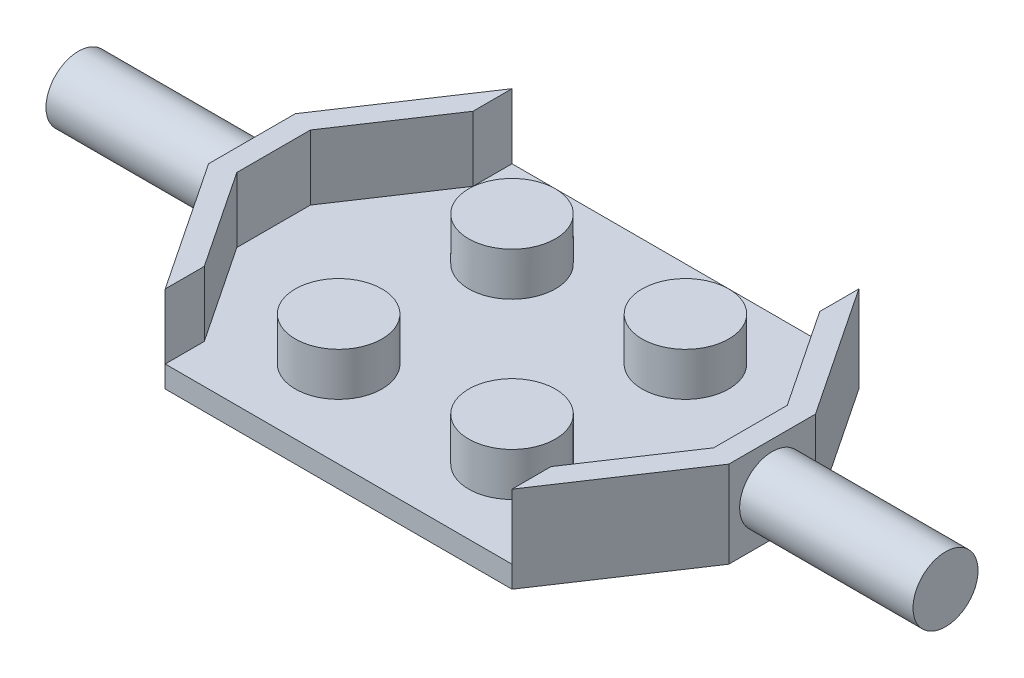
ISO-10303-21;
HEADER;
FILE_DESCRIPTION(('STEP AP214'),'2;1');
FILE_NAME('part.step','',(''),(''),'','','');
FILE_SCHEMA(('AUTOMOTIVE_DESIGN { 1 0 10303 214 1 1 1 1 }'));
ENDSEC;
DATA;
#1=APPLICATION_CONTEXT('core data for automotive mechanical design processes');
#2=APPLICATION_PROTOCOL_DEFINITION('international standard','automotive_design',2000,#1);
#3=PRODUCT_CONTEXT('',#1,'mechanical');
#4=PRODUCT('Part','Part','',(#3));
#5=PRODUCT_RELATED_PRODUCT_CATEGORY('part','',(#4));
#6=PRODUCT_DEFINITION_FORMATION('','',#4);
#7=PRODUCT_DEFINITION_CONTEXT('part definition',#1,'design');
#8=PRODUCT_DEFINITION('design','',#6,#7);
#9=PRODUCT_DEFINITION_SHAPE('','',#8);
#10=(LENGTH_UNIT() NAMED_UNIT(*) SI_UNIT(.MILLI.,.METRE.));
#11=(NAMED_UNIT(*) PLANE_ANGLE_UNIT() SI_UNIT($,.RADIAN.));
#12=(NAMED_UNIT(*) SI_UNIT($,.STERADIAN.) SOLID_ANGLE_UNIT());
#13=UNCERTAINTY_MEASURE_WITH_UNIT(LENGTH_MEASURE(1.E-05),#10,'distance_accuracy_value','');
#14=(GEOMETRIC_REPRESENTATION_CONTEXT(3) GLOBAL_UNCERTAINTY_ASSIGNED_CONTEXT((#13)) GLOBAL_UNIT_ASSIGNED_CONTEXT((#10,
#11,#12)) REPRESENTATION_CONTEXT('',''));
#15=CARTESIAN_POINT('',(0.,0.,0.));
#16=DIRECTION('',(0.,0.,1.));
#17=DIRECTION('',(1.,0.,0.));
#18=AXIS2_PLACEMENT_3D('',#15,#16,#17);
#19=CARTESIAN_POINT('',(0.,1.,0.));
#20=DIRECTION('',(0.,-1.,0.));
#21=DIRECTION('',(0.,0.,-1.));
#22=AXIS2_PLACEMENT_3D('',#19,#20,#21);
#23=PLANE('',#22);
#24=CARTESIAN_POINT('',(4.,1.,-4.));
#25=DIRECTION('',(0.,-1.,0.));
#26=DIRECTION('',(0.,0.,1.));
#27=AXIS2_PLACEMENT_3D('',#24,#25,#26);
#28=CIRCLE('',#27,2.);
#29=CARTESIAN_POINT('',(4.,1.,-2.));
#30=VERTEX_POINT('',#29);
#31=EDGE_CURVE('E263',#30,#30,#28,.T.);
#32=ORIENTED_EDGE('',*,*,#31,.T.);
#33=EDGE_LOOP('',(#32));
#34=FACE_BOUND('',#33,.T.);
#35=CARTESIAN_POINT('',(4.,1.,4.));
#36=DIRECTION('',(0.,-1.,0.));
#37=DIRECTION('',(0.,0.,-1.));
#38=AXIS2_PLACEMENT_3D('',#35,#36,#37);
#39=CIRCLE('',#38,2.);
#40=CARTESIAN_POINT('',(4.,1.,2.));
#41=VERTEX_POINT('',#40);
#42=EDGE_CURVE('E11',#41,#41,#39,.F.);
#43=ORIENTED_EDGE('',*,*,#42,.F.);
#44=EDGE_LOOP('',(#43));
#45=FACE_BOUND('',#44,.T.);
#46=CARTESIAN_POINT('',(-4.,1.,4.));
#47=DIRECTION('',(0.,-1.,0.));
#48=DIRECTION('',(0.,0.,-1.));
#49=AXIS2_PLACEMENT_3D('',#46,#47,#48);
#50=CIRCLE('',#49,2.);
#51=CARTESIAN_POINT('',(-4.,1.,2.));
#52=VERTEX_POINT('',#51);
#53=EDGE_CURVE('E370',#52,#52,#50,.T.);
#54=ORIENTED_EDGE('',*,*,#53,.T.);
#55=EDGE_LOOP('',(#54));
#56=FACE_BOUND('',#55,.T.);
#57=CARTESIAN_POINT('',(-4.,1.,-4.));
#58=DIRECTION('',(0.,-1.,0.));
#59=DIRECTION('',(0.,0.,-1.));
#60=AXIS2_PLACEMENT_3D('',#57,#58,#59);
#61=CIRCLE('',#60,2.);
#62=CARTESIAN_POINT('',(-4.,1.,-6.));
#63=VERTEX_POINT('',#62);
#64=EDGE_CURVE('E301',#63,#63,#61,.F.);
#65=ORIENTED_EDGE('',*,*,#64,.F.);
#66=EDGE_LOOP('',(#65));
#67=FACE_BOUND('',#66,.T.);
#68=DIRECTION('',(-0.554700196225229,0.,-0.832050294337844));
#69=VECTOR('',#68,1.);
#70=CARTESIAN_POINT('',(8.,1.,-6.197224362268));
#71=LINE('',#70,#69);
#72=CARTESIAN_POINT('',(11.,1.,-1.697224362268));
#73=VERTEX_POINT('',#72);
#74=CARTESIAN_POINT('',(8.,1.,-6.197224362268));
#75=VERTEX_POINT('',#74);
#76=EDGE_CURVE('E231',#73,#75,#71,.T.);
#77=ORIENTED_EDGE('',*,*,#76,.T.);
#78=DIRECTION('',(0.,0.,-1.));
#79=VECTOR('',#78,1.);
#80=CARTESIAN_POINT('',(8.,1.,-8.));
#81=LINE('',#80,#79);
#82=CARTESIAN_POINT('',(8.,1.,-8.));
#83=VERTEX_POINT('',#82);
#84=EDGE_CURVE('E227',#75,#83,#81,.T.);
#85=ORIENTED_EDGE('',*,*,#84,.T.);
#86=DIRECTION('',(-1.,0.,0.));
#87=VECTOR('',#86,1.);
#88=CARTESIAN_POINT('',(0.,1.,-8.));
#89=LINE('',#88,#87);
#90=CARTESIAN_POINT('',(-8.,1.,-8.));
#91=VERTEX_POINT('',#90);
#92=EDGE_CURVE('E383',#83,#91,#89,.T.);
#93=ORIENTED_EDGE('',*,*,#92,.T.);
#94=DIRECTION('',(0.,0.,-1.));
#95=VECTOR('',#94,1.);
#96=CARTESIAN_POINT('',(-8.,1.,-8.));
#97=LINE('',#96,#95);
#98=CARTESIAN_POINT('',(-8.,1.,-6.197224362268));
#99=VERTEX_POINT('',#98);
#100=EDGE_CURVE('E307',#99,#91,#97,.T.);
#101=ORIENTED_EDGE('',*,*,#100,.F.);
#102=DIRECTION('',(0.554700196225229,0.,-0.832050294337844));
#103=VECTOR('',#102,1.);
#104=CARTESIAN_POINT('',(-8.,1.,-6.197224362268));
#105=LINE('',#104,#103);
#106=CARTESIAN_POINT('',(-11.,1.,-1.697224362268));
#107=VERTEX_POINT('',#106);
#108=EDGE_CURVE('E336',#107,#99,#105,.T.);
#109=ORIENTED_EDGE('',*,*,#108,.F.);
#110=DIRECTION('',(0.,0.,-1.));
#111=VECTOR('',#110,1.);
#112=CARTESIAN_POINT('',(-11.,1.,-1.697224362268));
#113=LINE('',#112,#111);
#114=CARTESIAN_POINT('',(-11.,1.,1.69722436226801));
#115=VERTEX_POINT('',#114);
#116=EDGE_CURVE('E68',#115,#107,#113,.T.);
#117=ORIENTED_EDGE('',*,*,#116,.F.);
#118=DIRECTION('',(-0.554700196225229,0.,-0.832050294337844));
#119=VECTOR('',#118,1.);
#120=CARTESIAN_POINT('',(-11.,1.,1.69722436226801));
#121=LINE('',#120,#119);
#122=CARTESIAN_POINT('',(-8.,1.,6.19722436226801));
#123=VERTEX_POINT('',#122);
#124=EDGE_CURVE('E63',#123,#115,#121,.T.);
#125=ORIENTED_EDGE('',*,*,#124,.F.);
#126=DIRECTION('',(0.,0.,-1.));
#127=VECTOR('',#126,1.);
#128=CARTESIAN_POINT('',(-8.,1.,6.19722436226801));
#129=LINE('',#128,#127);
#130=CARTESIAN_POINT('',(-8.,1.,8.));
#131=VERTEX_POINT('',#130);
#132=EDGE_CURVE('E297',#131,#123,#129,.T.);
#133=ORIENTED_EDGE('',*,*,#132,.F.);
#134=DIRECTION('',(1.,0.,0.));
#135=VECTOR('',#134,1.);
#136=CARTESIAN_POINT('',(0.,1.,8.));
#137=LINE('',#136,#135);
#138=CARTESIAN_POINT('',(8.,1.,8.));
#139=VERTEX_POINT('',#138);
#140=EDGE_CURVE('E379',#131,#139,#137,.T.);
#141=ORIENTED_EDGE('',*,*,#140,.T.);
#142=DIRECTION('',(0.,0.,-1.));
#143=VECTOR('',#142,1.);
#144=CARTESIAN_POINT('',(8.,1.,6.19722436226801));
#145=LINE('',#144,#143);
#146=CARTESIAN_POINT('',(8.,1.,6.19722436226801));
#147=VERTEX_POINT('',#146);
#148=EDGE_CURVE('E196',#139,#147,#145,.T.);
#149=ORIENTED_EDGE('',*,*,#148,.T.);
#150=DIRECTION('',(0.554700196225229,0.,-0.832050294337844));
#151=VECTOR('',#150,1.);
#152=CARTESIAN_POINT('',(11.,1.,1.69722436226801));
#153=LINE('',#152,#151);
#154=CARTESIAN_POINT('',(11.,1.,1.69722436226801));
#155=VERTEX_POINT('',#154);
#156=EDGE_CURVE('E240',#147,#155,#153,.T.);
#157=ORIENTED_EDGE('',*,*,#156,.T.);
#158=DIRECTION('',(0.,0.,-1.));
#159=VECTOR('',#158,1.);
#160=CARTESIAN_POINT('',(11.,1.,-1.697224362268));
#161=LINE('',#160,#159);
#162=EDGE_CURVE('E236',#155,#73,#161,.T.);
#163=ORIENTED_EDGE('',*,*,#162,.T.);
#164=EDGE_LOOP('',(#77,#85,#93,#101,#109,#117,#125,#133,#141,#149,#157,#163));
#165=FACE_BOUND('',#164,.T.);
#166=ADVANCED_FACE('F47',(#34,#45,#56,#67,#165),#23,.F.);
#167=CARTESIAN_POINT('',(0.,1.,8.));
#168=DIRECTION('',(0.,0.,-1.));
#169=DIRECTION('',(-1.,0.,0.));
#170=AXIS2_PLACEMENT_3D('',#167,#168,#169);
#171=PLANE('',#170);
#172=DIRECTION('',(1.,0.,0.));
#173=VECTOR('',#172,1.);
#174=CARTESIAN_POINT('',(0.,0.,8.));
#175=LINE('',#174,#173);
#176=CARTESIAN_POINT('',(-8.,0.,8.));
#177=VERTEX_POINT('',#176);
#178=CARTESIAN_POINT('',(8.,0.,8.));
#179=VERTEX_POINT('',#178);
#180=EDGE_CURVE('E375',#177,#179,#175,.T.);
#181=ORIENTED_EDGE('',*,*,#180,.T.);
#182=DIRECTION('',(0.,-1.,0.));
#183=VECTOR('',#182,1.);
#184=CARTESIAN_POINT('',(8.,1.,8.));
#185=LINE('',#184,#183);
#186=EDGE_CURVE('E289',#139,#179,#185,.T.);
#187=ORIENTED_EDGE('',*,*,#186,.F.);
#188=ORIENTED_EDGE('',*,*,#140,.F.);
#189=DIRECTION('',(0.,-1.,0.));
#190=VECTOR('',#189,1.);
#191=CARTESIAN_POINT('',(-8.,1.,8.));
#192=LINE('',#191,#190);
#193=EDGE_CURVE('E387',#131,#177,#192,.T.);
#194=ORIENTED_EDGE('',*,*,#193,.T.);
#195=EDGE_LOOP('',(#181,#187,#188,#194));
#196=FACE_BOUND('',#195,.T.);
#197=ADVANCED_FACE('F49',(#196),#171,.F.);
#198=CARTESIAN_POINT('',(0.,1.,-8.));
#199=DIRECTION('',(0.,0.,1.));
#200=DIRECTION('',(1.,0.,0.));
#201=AXIS2_PLACEMENT_3D('',#198,#199,#200);
#202=PLANE('',#201);
#203=DIRECTION('',(-1.,0.,0.));
#204=VECTOR('',#203,1.);
#205=CARTESIAN_POINT('',(0.,0.,-8.));
#206=LINE('',#205,#204);
#207=CARTESIAN_POINT('',(8.,0.,-8.));
#208=VERTEX_POINT('',#207);
#209=CARTESIAN_POINT('',(-8.,0.,-8.));
#210=VERTEX_POINT('',#209);
#211=EDGE_CURVE('E390',#208,#210,#206,.T.);
#212=ORIENTED_EDGE('',*,*,#211,.T.);
#213=DIRECTION('',(0.,-1.,0.));
#214=VECTOR('',#213,1.);
#215=CARTESIAN_POINT('',(-8.,1.,-8.));
#216=LINE('',#215,#214);
#217=EDGE_CURVE('E412',#91,#210,#216,.T.);
#218=ORIENTED_EDGE('',*,*,#217,.F.);
#219=ORIENTED_EDGE('',*,*,#92,.F.);
#220=DIRECTION('',(0.,-1.,0.));
#221=VECTOR('',#220,1.);
#222=CARTESIAN_POINT('',(8.,1.,-8.));
#223=LINE('',#222,#221);
#224=EDGE_CURVE('E184',#83,#208,#223,.T.);
#225=ORIENTED_EDGE('',*,*,#224,.T.);
#226=EDGE_LOOP('',(#212,#218,#219,#225));
#227=FACE_BOUND('',#226,.T.);
#228=ADVANCED_FACE('F452',(#227),#202,.F.);
#229=CARTESIAN_POINT('',(-8.,1.,-8.));
#230=DIRECTION('',(0.832050294337844,0.,0.554700196225229));
#231=DIRECTION('',(0.554700196225229,0.,-0.832050294337844));
#232=AXIS2_PLACEMENT_3D('',#229,#230,#231);
#233=PLANE('',#232);
#234=DIRECTION('',(-0.554700196225229,0.,0.832050294337844));
#235=VECTOR('',#234,1.);
#236=CARTESIAN_POINT('',(-8.,0.,-8.));
#237=LINE('',#236,#235);
#238=CARTESIAN_POINT('',(-12.,0.,-2.));
#239=VERTEX_POINT('',#238);
#240=EDGE_CURVE('E393',#210,#239,#237,.T.);
#241=ORIENTED_EDGE('',*,*,#240,.T.);
#242=DIRECTION('',(0.,-1.,0.));
#243=VECTOR('',#242,1.);
#244=CARTESIAN_POINT('',(-12.,1.,-2.));
#245=LINE('',#244,#243);
#246=CARTESIAN_POINT('',(-12.,4.,-2.));
#247=VERTEX_POINT('',#246);
#248=EDGE_CURVE('E408',#247,#239,#245,.T.);
#249=ORIENTED_EDGE('',*,*,#248,.F.);
#250=DIRECTION('',(-0.554700196225229,0.,0.832050294337844));
#251=VECTOR('',#250,1.);
#252=CARTESIAN_POINT('',(-8.,4.,-8.));
#253=LINE('',#252,#251);
#254=CARTESIAN_POINT('',(-8.,4.,-8.));
#255=VERTEX_POINT('',#254);
#256=EDGE_CURVE('E325',#255,#247,#253,.T.);
#257=ORIENTED_EDGE('',*,*,#256,.F.);
#258=DIRECTION('',(0.,-1.,0.));
#259=VECTOR('',#258,1.);
#260=CARTESIAN_POINT('',(-8.,4.,-8.));
#261=LINE('',#260,#259);
#262=EDGE_CURVE('E329',#255,#91,#261,.T.);
#263=ORIENTED_EDGE('',*,*,#262,.T.);
#264=ORIENTED_EDGE('',*,*,#217,.T.);
#265=EDGE_LOOP('',(#241,#249,#257,#263,#264));
#266=FACE_BOUND('',#265,.T.);
#267=ADVANCED_FACE('F490',(#266),#233,.F.);
#268=CARTESIAN_POINT('',(-12.,1.,2.));
#269=DIRECTION('',(1.,0.,0.));
#270=DIRECTION('',(0.,0.,-1.));
#271=AXIS2_PLACEMENT_3D('',#268,#269,#270);
#272=PLANE('',#271);
#273=CARTESIAN_POINT('',(-12.,2.,0.));
#274=DIRECTION('',(-1.,0.,0.));
#275=DIRECTION('',(0.,0.,1.));
#276=AXIS2_PLACEMENT_3D('',#273,#274,#275);
#277=CIRCLE('',#276,1.5);
#278=CARTESIAN_POINT('',(-12.,2.,1.5));
#279=VERTEX_POINT('',#278);
#280=EDGE_CURVE('E56',#279,#279,#277,.T.);
#281=ORIENTED_EDGE('',*,*,#280,.F.);
#282=EDGE_LOOP('',(#281));
#283=FACE_BOUND('',#282,.T.);
#284=DIRECTION('',(0.,0.,1.));
#285=VECTOR('',#284,1.);
#286=CARTESIAN_POINT('',(-12.,0.,2.));
#287=LINE('',#286,#285);
#288=CARTESIAN_POINT('',(-12.,0.,2.));
#289=VERTEX_POINT('',#288);
#290=EDGE_CURVE('E396',#239,#289,#287,.T.);
#291=ORIENTED_EDGE('',*,*,#290,.T.);
#292=DIRECTION('',(0.,-1.,0.));
#293=VECTOR('',#292,1.);
#294=CARTESIAN_POINT('',(-12.,1.,2.));
#295=LINE('',#294,#293);
#296=CARTESIAN_POINT('',(-12.,4.,2.));
#297=VERTEX_POINT('',#296);
#298=EDGE_CURVE('E404',#297,#289,#295,.T.);
#299=ORIENTED_EDGE('',*,*,#298,.F.);
#300=DIRECTION('',(0.,0.,1.));
#301=VECTOR('',#300,1.);
#302=CARTESIAN_POINT('',(-12.,4.,-2.));
#303=LINE('',#302,#301);
#304=EDGE_CURVE('E302',#247,#297,#303,.T.);
#305=ORIENTED_EDGE('',*,*,#304,.F.);
#306=ORIENTED_EDGE('',*,*,#248,.T.);
#307=EDGE_LOOP('',(#291,#299,#305,#306));
#308=FACE_BOUND('',#307,.T.);
#309=ADVANCED_FACE('F488',(#283,#308),#272,.F.);
#310=CARTESIAN_POINT('',(-8.,1.,8.));
#311=DIRECTION('',(0.832050294337844,0.,-0.554700196225229));
#312=DIRECTION('',(-0.554700196225229,0.,-0.832050294337844));
#313=AXIS2_PLACEMENT_3D('',#310,#311,#312);
#314=PLANE('',#313);
#315=DIRECTION('',(0.554700196225229,0.,0.832050294337844));
#316=VECTOR('',#315,1.);
#317=CARTESIAN_POINT('',(-8.,0.,8.));
#318=LINE('',#317,#316);
#319=EDGE_CURVE('E384',#289,#177,#318,.T.);
#320=ORIENTED_EDGE('',*,*,#319,.T.);
#321=ORIENTED_EDGE('',*,*,#193,.F.);
#322=DIRECTION('',(0.,-1.,0.));
#323=VECTOR('',#322,1.);
#324=CARTESIAN_POINT('',(-8.,4.,8.));
#325=LINE('',#324,#323);
#326=CARTESIAN_POINT('',(-8.,4.,8.));
#327=VERTEX_POINT('',#326);
#328=EDGE_CURVE('E362',#327,#131,#325,.T.);
#329=ORIENTED_EDGE('',*,*,#328,.F.);
#330=DIRECTION('',(0.554700196225229,0.,0.832050294337844));
#331=VECTOR('',#330,1.);
#332=CARTESIAN_POINT('',(-12.,4.,2.));
#333=LINE('',#332,#331);
#334=EDGE_CURVE('E306',#297,#327,#333,.T.);
#335=ORIENTED_EDGE('',*,*,#334,.F.);
#336=ORIENTED_EDGE('',*,*,#298,.T.);
#337=EDGE_LOOP('',(#320,#321,#329,#335,#336));
#338=FACE_BOUND('',#337,.T.);
#339=ADVANCED_FACE('F482',(#338),#314,.F.);
#340=CARTESIAN_POINT('',(0.,0.,0.));
#341=DIRECTION('',(0.,-1.,0.));
#342=DIRECTION('',(0.,0.,-1.));
#343=AXIS2_PLACEMENT_3D('',#340,#341,#342);
#344=PLANE('',#343);
#345=ORIENTED_EDGE('',*,*,#180,.F.);
#346=ORIENTED_EDGE('',*,*,#319,.F.);
#347=ORIENTED_EDGE('',*,*,#290,.F.);
#348=ORIENTED_EDGE('',*,*,#240,.F.);
#349=ORIENTED_EDGE('',*,*,#211,.F.);
#350=DIRECTION('',(0.554700196225229,0.,0.832050294337844));
#351=VECTOR('',#350,1.);
#352=CARTESIAN_POINT('',(8.,0.,-8.));
#353=LINE('',#352,#351);
#354=CARTESIAN_POINT('',(12.,0.,-2.));
#355=VERTEX_POINT('',#354);
#356=EDGE_CURVE('E281',#208,#355,#353,.T.);
#357=ORIENTED_EDGE('',*,*,#356,.T.);
#358=DIRECTION('',(0.,0.,1.));
#359=VECTOR('',#358,1.);
#360=CARTESIAN_POINT('',(12.,0.,2.));
#361=LINE('',#360,#359);
#362=CARTESIAN_POINT('',(12.,0.,2.));
#363=VERTEX_POINT('',#362);
#364=EDGE_CURVE('E177',#355,#363,#361,.T.);
#365=ORIENTED_EDGE('',*,*,#364,.T.);
#366=DIRECTION('',(-0.554700196225229,0.,0.832050294337844));
#367=VECTOR('',#366,1.);
#368=CARTESIAN_POINT('',(8.,0.,8.));
#369=LINE('',#368,#367);
#370=EDGE_CURVE('E275',#363,#179,#369,.T.);
#371=ORIENTED_EDGE('',*,*,#370,.T.);
#372=EDGE_LOOP('',(#345,#346,#347,#348,#349,#357,#365,#371));
#373=FACE_BOUND('',#372,.T.);
#374=ADVANCED_FACE('F449',(#373),#344,.T.);
#375=CARTESIAN_POINT('',(-4.,3.,4.));
#376=DIRECTION('',(0.,-1.,0.));
#377=DIRECTION('',(0.,0.,-1.));
#378=AXIS2_PLACEMENT_3D('',#375,#376,#377);
#379=CYLINDRICAL_SURFACE('',#378,2.);
#380=CARTESIAN_POINT('',(-4.,3.,4.));
#381=DIRECTION('',(0.,-1.,0.));
#382=DIRECTION('',(0.,0.,-1.));
#383=AXIS2_PLACEMENT_3D('',#380,#381,#382);
#384=CIRCLE('',#383,2.);
#385=CARTESIAN_POINT('',(-4.,3.,2.));
#386=VERTEX_POINT('',#385);
#387=EDGE_CURVE('E371',#386,#386,#384,.T.);
#388=ORIENTED_EDGE('',*,*,#387,.T.);
#389=EDGE_LOOP('',(#388));
#390=FACE_BOUND('',#389,.T.);
#391=ORIENTED_EDGE('',*,*,#53,.F.);
#392=EDGE_LOOP('',(#391));
#393=FACE_BOUND('',#392,.T.);
#394=ADVANCED_FACE('F504',(#390,#393),#379,.T.);
#395=CARTESIAN_POINT('',(-4.,3.,4.));
#396=DIRECTION('',(0.,-1.,0.));
#397=DIRECTION('',(0.,0.,-1.));
#398=AXIS2_PLACEMENT_3D('',#395,#396,#397);
#399=PLANE('',#398);
#400=ORIENTED_EDGE('',*,*,#387,.F.);
#401=EDGE_LOOP('',(#400));
#402=FACE_BOUND('',#401,.T.);
#403=ADVANCED_FACE('F508',(#402),#399,.F.);
#404=CARTESIAN_POINT('',(-4.,3.,-4.));
#405=DIRECTION('',(0.,-1.,0.));
#406=DIRECTION('',(0.,0.,-1.));
#407=AXIS2_PLACEMENT_3D('',#404,#405,#406);
#408=CYLINDRICAL_SURFACE('',#407,2.);
#409=CARTESIAN_POINT('',(-4.,3.,-4.));
#410=DIRECTION('',(0.,1.,0.));
#411=DIRECTION('',(0.,0.,1.));
#412=AXIS2_PLACEMENT_3D('',#409,#410,#411);
#413=CIRCLE('',#412,2.);
#414=CARTESIAN_POINT('',(-4.,3.,-2.));
#415=VERTEX_POINT('',#414);
#416=EDGE_CURVE('E366',#415,#415,#413,.T.);
#417=ORIENTED_EDGE('',*,*,#416,.F.);
#418=EDGE_LOOP('',(#417));
#419=FACE_BOUND('',#418,.T.);
#420=ORIENTED_EDGE('',*,*,#64,.T.);
#421=EDGE_LOOP('',(#420));
#422=FACE_BOUND('',#421,.T.);
#423=ADVANCED_FACE('F419',(#419,#422),#408,.T.);
#424=CARTESIAN_POINT('',(-4.,3.,-4.));
#425=DIRECTION('',(0.,1.,0.));
#426=DIRECTION('',(0.,0.,1.));
#427=AXIS2_PLACEMENT_3D('',#424,#425,#426);
#428=PLANE('',#427);
#429=ORIENTED_EDGE('',*,*,#416,.T.);
#430=EDGE_LOOP('',(#429));
#431=FACE_BOUND('',#430,.T.);
#432=ADVANCED_FACE('F513',(#431),#428,.T.);
#433=CARTESIAN_POINT('',(-8.,4.,6.19722436226801));
#434=DIRECTION('',(-1.,0.,0.));
#435=DIRECTION('',(0.,0.,1.));
#436=AXIS2_PLACEMENT_3D('',#433,#434,#435);
#437=PLANE('',#436);
#438=ORIENTED_EDGE('',*,*,#132,.T.);
#439=DIRECTION('',(0.,-1.,0.));
#440=VECTOR('',#439,1.);
#441=CARTESIAN_POINT('',(-8.,4.,6.19722436226801));
#442=LINE('',#441,#440);
#443=CARTESIAN_POINT('',(-8.,4.,6.19722436226801));
#444=VERTEX_POINT('',#443);
#445=EDGE_CURVE('E358',#444,#123,#442,.T.);
#446=ORIENTED_EDGE('',*,*,#445,.F.);
#447=DIRECTION('',(0.,0.,-1.));
#448=VECTOR('',#447,1.);
#449=CARTESIAN_POINT('',(-8.,4.,6.19722436226801));
#450=LINE('',#449,#448);
#451=EDGE_CURVE('E310',#327,#444,#450,.T.);
#452=ORIENTED_EDGE('',*,*,#451,.F.);
#453=ORIENTED_EDGE('',*,*,#328,.T.);
#454=EDGE_LOOP('',(#438,#446,#452,#453));
#455=FACE_BOUND('',#454,.T.);
#456=ADVANCED_FACE('F477',(#455),#437,.F.);
#457=CARTESIAN_POINT('',(-11.,4.,1.69722436226801));
#458=DIRECTION('',(-0.832050294337844,0.,0.554700196225229));
#459=DIRECTION('',(0.554700196225229,0.,0.832050294337844));
#460=AXIS2_PLACEMENT_3D('',#457,#458,#459);
#461=PLANE('',#460);
#462=ORIENTED_EDGE('',*,*,#124,.T.);
#463=DIRECTION('',(0.,-1.,0.));
#464=VECTOR('',#463,1.);
#465=CARTESIAN_POINT('',(-11.,4.,1.69722436226801));
#466=LINE('',#465,#464);
#467=CARTESIAN_POINT('',(-11.,4.,1.69722436226801));
#468=VERTEX_POINT('',#467);
#469=EDGE_CURVE('E354',#468,#115,#466,.T.);
#470=ORIENTED_EDGE('',*,*,#469,.F.);
#471=DIRECTION('',(-0.554700196225229,0.,-0.832050294337844));
#472=VECTOR('',#471,1.);
#473=CARTESIAN_POINT('',(-11.,4.,1.69722436226801));
#474=LINE('',#473,#472);
#475=EDGE_CURVE('E313',#444,#468,#474,.T.);
#476=ORIENTED_EDGE('',*,*,#475,.F.);
#477=ORIENTED_EDGE('',*,*,#445,.T.);
#478=EDGE_LOOP('',(#462,#470,#476,#477));
#479=FACE_BOUND('',#478,.T.);
#480=ADVANCED_FACE('F473',(#479),#461,.F.);
#481=CARTESIAN_POINT('',(-11.,4.,-1.697224362268));
#482=DIRECTION('',(-1.,0.,0.));
#483=DIRECTION('',(0.,0.,1.));
#484=AXIS2_PLACEMENT_3D('',#481,#482,#483);
#485=PLANE('',#484);
#486=ORIENTED_EDGE('',*,*,#116,.T.);
#487=DIRECTION('',(0.,-1.,0.));
#488=VECTOR('',#487,1.);
#489=CARTESIAN_POINT('',(-11.,4.,-1.697224362268));
#490=LINE('',#489,#488);
#491=CARTESIAN_POINT('',(-11.,4.,-1.697224362268));
#492=VERTEX_POINT('',#491);
#493=EDGE_CURVE('E350',#492,#107,#490,.T.);
#494=ORIENTED_EDGE('',*,*,#493,.F.);
#495=DIRECTION('',(0.,0.,-1.));
#496=VECTOR('',#495,1.);
#497=CARTESIAN_POINT('',(-11.,4.,-1.697224362268));
#498=LINE('',#497,#496);
#499=EDGE_CURVE('E316',#468,#492,#498,.T.);
#500=ORIENTED_EDGE('',*,*,#499,.F.);
#501=ORIENTED_EDGE('',*,*,#469,.T.);
#502=EDGE_LOOP('',(#486,#494,#500,#501));
#503=FACE_BOUND('',#502,.T.);
#504=ADVANCED_FACE('F471',(#503),#485,.F.);
#505=CARTESIAN_POINT('',(-8.,4.,-6.197224362268));
#506=DIRECTION('',(-0.832050294337844,0.,-0.554700196225229));
#507=DIRECTION('',(-0.554700196225229,0.,0.832050294337844));
#508=AXIS2_PLACEMENT_3D('',#505,#506,#507);
#509=PLANE('',#508);
#510=ORIENTED_EDGE('',*,*,#108,.T.);
#511=DIRECTION('',(0.,-1.,0.));
#512=VECTOR('',#511,1.);
#513=CARTESIAN_POINT('',(-8.,4.,-6.197224362268));
#514=LINE('',#513,#512);
#515=CARTESIAN_POINT('',(-8.,4.,-6.197224362268));
#516=VERTEX_POINT('',#515);
#517=EDGE_CURVE('E346',#516,#99,#514,.T.);
#518=ORIENTED_EDGE('',*,*,#517,.F.);
#519=DIRECTION('',(0.554700196225229,0.,-0.832050294337844));
#520=VECTOR('',#519,1.);
#521=CARTESIAN_POINT('',(-8.,4.,-6.197224362268));
#522=LINE('',#521,#520);
#523=EDGE_CURVE('E319',#492,#516,#522,.T.);
#524=ORIENTED_EDGE('',*,*,#523,.F.);
#525=ORIENTED_EDGE('',*,*,#493,.T.);
#526=EDGE_LOOP('',(#510,#518,#524,#525));
#527=FACE_BOUND('',#526,.T.);
#528=ADVANCED_FACE('F458',(#527),#509,.F.);
#529=CARTESIAN_POINT('',(-8.,4.,-8.));
#530=DIRECTION('',(-1.,0.,0.));
#531=DIRECTION('',(0.,0.,1.));
#532=AXIS2_PLACEMENT_3D('',#529,#530,#531);
#533=PLANE('',#532);
#534=ORIENTED_EDGE('',*,*,#100,.T.);
#535=ORIENTED_EDGE('',*,*,#262,.F.);
#536=DIRECTION('',(0.,0.,-1.));
#537=VECTOR('',#536,1.);
#538=CARTESIAN_POINT('',(-8.,4.,-8.));
#539=LINE('',#538,#537);
#540=EDGE_CURVE('E322',#516,#255,#539,.T.);
#541=ORIENTED_EDGE('',*,*,#540,.F.);
#542=ORIENTED_EDGE('',*,*,#517,.T.);
#543=EDGE_LOOP('',(#534,#535,#541,#542));
#544=FACE_BOUND('',#543,.T.);
#545=ADVANCED_FACE('F462',(#544),#533,.F.);
#546=CARTESIAN_POINT('',(0.,4.,0.));
#547=DIRECTION('',(0.,1.,0.));
#548=DIRECTION('',(0.,0.,1.));
#549=AXIS2_PLACEMENT_3D('',#546,#547,#548);
#550=PLANE('',#549);
#551=ORIENTED_EDGE('',*,*,#304,.T.);
#552=ORIENTED_EDGE('',*,*,#334,.T.);
#553=ORIENTED_EDGE('',*,*,#451,.T.);
#554=ORIENTED_EDGE('',*,*,#475,.T.);
#555=ORIENTED_EDGE('',*,*,#499,.T.);
#556=ORIENTED_EDGE('',*,*,#523,.T.);
#557=ORIENTED_EDGE('',*,*,#540,.T.);
#558=ORIENTED_EDGE('',*,*,#256,.T.);
#559=EDGE_LOOP('',(#551,#552,#553,#554,#555,#556,#557,#558));
#560=FACE_BOUND('',#559,.T.);
#561=ADVANCED_FACE('F465',(#560),#550,.T.);
#562=CARTESIAN_POINT('',(-20.,2.,0.));
#563=DIRECTION('',(1.,0.,0.));
#564=DIRECTION('',(0.,0.,-1.));
#565=AXIS2_PLACEMENT_3D('',#562,#563,#564);
#566=CYLINDRICAL_SURFACE('',#565,1.5);
#567=CARTESIAN_POINT('',(-20.,2.,0.));
#568=DIRECTION('',(-1.,0.,0.));
#569=DIRECTION('',(0.,0.,1.));
#570=AXIS2_PLACEMENT_3D('',#567,#568,#569);
#571=CIRCLE('',#570,1.5);
#572=CARTESIAN_POINT('',(-20.,2.,1.5));
#573=VERTEX_POINT('',#572);
#574=EDGE_CURVE('E293',#573,#573,#571,.T.);
#575=ORIENTED_EDGE('',*,*,#574,.F.);
#576=EDGE_LOOP('',(#575));
#577=FACE_BOUND('',#576,.T.);
#578=ORIENTED_EDGE('',*,*,#280,.T.);
#579=EDGE_LOOP('',(#578));
#580=FACE_BOUND('',#579,.T.);
#581=ADVANCED_FACE('F531',(#577,#580),#566,.T.);
#582=CARTESIAN_POINT('',(-20.,2.,0.));
#583=DIRECTION('',(-1.,0.,0.));
#584=DIRECTION('',(0.,0.,1.));
#585=AXIS2_PLACEMENT_3D('',#582,#583,#584);
#586=PLANE('',#585);
#587=ORIENTED_EDGE('',*,*,#574,.T.);
#588=EDGE_LOOP('',(#587));
#589=FACE_BOUND('',#588,.T.);
#590=ADVANCED_FACE('F534',(#589),#586,.T.);
#591=CARTESIAN_POINT('',(8.,1.,8.));
#592=DIRECTION('',(0.832050294337844,0.,0.554700196225229));
#593=DIRECTION('',(0.554700196225229,0.,-0.832050294337844));
#594=AXIS2_PLACEMENT_3D('',#591,#592,#593);
#595=PLANE('',#594);
#596=ORIENTED_EDGE('',*,*,#370,.F.);
#597=DIRECTION('',(0.,-1.,0.));
#598=VECTOR('',#597,1.);
#599=CARTESIAN_POINT('',(12.,1.,2.));
#600=LINE('',#599,#598);
#601=CARTESIAN_POINT('',(12.,4.,2.));
#602=VERTEX_POINT('',#601);
#603=EDGE_CURVE('E183',#602,#363,#600,.T.);
#604=ORIENTED_EDGE('',*,*,#603,.F.);
#605=DIRECTION('',(-0.554700196225229,0.,0.832050294337844));
#606=VECTOR('',#605,1.);
#607=CARTESIAN_POINT('',(12.,4.,2.));
#608=LINE('',#607,#606);
#609=CARTESIAN_POINT('',(8.,4.,8.));
#610=VERTEX_POINT('',#609);
#611=EDGE_CURVE('E194',#602,#610,#608,.T.);
#612=ORIENTED_EDGE('',*,*,#611,.T.);
#613=DIRECTION('',(0.,-1.,0.));
#614=VECTOR('',#613,1.);
#615=CARTESIAN_POINT('',(8.,4.,8.));
#616=LINE('',#615,#614);
#617=EDGE_CURVE('E226',#610,#139,#616,.T.);
#618=ORIENTED_EDGE('',*,*,#617,.T.);
#619=ORIENTED_EDGE('',*,*,#186,.T.);
#620=EDGE_LOOP('',(#596,#604,#612,#618,#619));
#621=FACE_BOUND('',#620,.T.);
#622=ADVANCED_FACE('F445',(#621),#595,.T.);
#623=CARTESIAN_POINT('',(12.,1.,2.));
#624=DIRECTION('',(1.,0.,0.));
#625=DIRECTION('',(0.,0.,-1.));
#626=AXIS2_PLACEMENT_3D('',#623,#624,#625);
#627=PLANE('',#626);
#628=CARTESIAN_POINT('',(12.,2.,0.));
#629=DIRECTION('',(-1.,0.,0.));
#630=DIRECTION('',(0.,0.,1.));
#631=AXIS2_PLACEMENT_3D('',#628,#629,#630);
#632=CIRCLE('',#631,1.5);
#633=CARTESIAN_POINT('',(12.,2.,1.5));
#634=VERTEX_POINT('',#633);
#635=EDGE_CURVE('E586',#634,#634,#632,.T.);
#636=ORIENTED_EDGE('',*,*,#635,.T.);
#637=EDGE_LOOP('',(#636));
#638=FACE_BOUND('',#637,.T.);
#639=ORIENTED_EDGE('',*,*,#364,.F.);
#640=DIRECTION('',(0.,-1.,0.));
#641=VECTOR('',#640,1.);
#642=CARTESIAN_POINT('',(12.,1.,-2.));
#643=LINE('',#642,#641);
#644=CARTESIAN_POINT('',(12.,4.,-2.));
#645=VERTEX_POINT('',#644);
#646=EDGE_CURVE('E171',#645,#355,#643,.T.);
#647=ORIENTED_EDGE('',*,*,#646,.F.);
#648=DIRECTION('',(0.,0.,1.));
#649=VECTOR('',#648,1.);
#650=CARTESIAN_POINT('',(12.,4.,-2.));
#651=LINE('',#650,#649);
#652=EDGE_CURVE('E174',#645,#602,#651,.T.);
#653=ORIENTED_EDGE('',*,*,#652,.T.);
#654=ORIENTED_EDGE('',*,*,#603,.T.);
#655=EDGE_LOOP('',(#639,#647,#653,#654));
#656=FACE_BOUND('',#655,.T.);
#657=ADVANCED_FACE('F173',(#638,#656),#627,.T.);
#658=CARTESIAN_POINT('',(8.,1.,-8.));
#659=DIRECTION('',(0.832050294337844,0.,-0.554700196225229));
#660=DIRECTION('',(-0.554700196225229,0.,-0.832050294337844));
#661=AXIS2_PLACEMENT_3D('',#658,#659,#660);
#662=PLANE('',#661);
#663=ORIENTED_EDGE('',*,*,#356,.F.);
#664=ORIENTED_EDGE('',*,*,#224,.F.);
#665=DIRECTION('',(0.,-1.,0.));
#666=VECTOR('',#665,1.);
#667=CARTESIAN_POINT('',(8.,4.,-8.));
#668=LINE('',#667,#666);
#669=CARTESIAN_POINT('',(8.,4.,-8.));
#670=VERTEX_POINT('',#669);
#671=EDGE_CURVE('E200',#670,#83,#668,.T.);
#672=ORIENTED_EDGE('',*,*,#671,.F.);
#673=DIRECTION('',(0.554700196225229,0.,0.832050294337844));
#674=VECTOR('',#673,1.);
#675=CARTESIAN_POINT('',(8.,4.,-8.));
#676=LINE('',#675,#674);
#677=EDGE_CURVE('E190',#670,#645,#676,.T.);
#678=ORIENTED_EDGE('',*,*,#677,.T.);
#679=ORIENTED_EDGE('',*,*,#646,.T.);
#680=EDGE_LOOP('',(#663,#664,#672,#678,#679));
#681=FACE_BOUND('',#680,.T.);
#682=ADVANCED_FACE('F198',(#681),#662,.T.);
#683=CARTESIAN_POINT('',(4.,3.,4.));
#684=DIRECTION('',(0.,-1.,0.));
#685=DIRECTION('',(0.,0.,-1.));
#686=AXIS2_PLACEMENT_3D('',#683,#684,#685);
#687=CYLINDRICAL_SURFACE('',#686,2.);
#688=CARTESIAN_POINT('',(4.,3.,4.));
#689=DIRECTION('',(0.,1.,0.));
#690=DIRECTION('',(0.,0.,-1.));
#691=AXIS2_PLACEMENT_3D('',#688,#689,#690);
#692=CIRCLE('',#691,2.);
#693=CARTESIAN_POINT('',(4.,3.,2.));
#694=VERTEX_POINT('',#693);
#695=EDGE_CURVE('E268',#694,#694,#692,.T.);
#696=ORIENTED_EDGE('',*,*,#695,.F.);
#697=EDGE_LOOP('',(#696));
#698=FACE_BOUND('',#697,.T.);
#699=ORIENTED_EDGE('',*,*,#42,.T.);
#700=EDGE_LOOP('',(#699));
#701=FACE_BOUND('',#700,.T.);
#702=ADVANCED_FACE('F546',(#698,#701),#687,.T.);
#703=CARTESIAN_POINT('',(4.,3.,4.));
#704=DIRECTION('',(0.,-1.,0.));
#705=DIRECTION('',(0.,0.,-1.));
#706=AXIS2_PLACEMENT_3D('',#703,#704,#705);
#707=PLANE('',#706);
#708=ORIENTED_EDGE('',*,*,#695,.T.);
#709=EDGE_LOOP('',(#708));
#710=FACE_BOUND('',#709,.T.);
#711=ADVANCED_FACE('F549',(#710),#707,.F.);
#712=CARTESIAN_POINT('',(4.,3.,-4.));
#713=DIRECTION('',(0.,-1.,0.));
#714=DIRECTION('',(0.,0.,-1.));
#715=AXIS2_PLACEMENT_3D('',#712,#713,#714);
#716=CYLINDRICAL_SURFACE('',#715,2.);
#717=CARTESIAN_POINT('',(4.,3.,-4.));
#718=DIRECTION('',(0.,-1.,0.));
#719=DIRECTION('',(0.,0.,1.));
#720=AXIS2_PLACEMENT_3D('',#717,#718,#719);
#721=CIRCLE('',#720,2.);
#722=CARTESIAN_POINT('',(4.,3.,-2.));
#723=VERTEX_POINT('',#722);
#724=EDGE_CURVE('E264',#723,#723,#721,.T.);
#725=ORIENTED_EDGE('',*,*,#724,.T.);
#726=EDGE_LOOP('',(#725));
#727=FACE_BOUND('',#726,.T.);
#728=ORIENTED_EDGE('',*,*,#31,.F.);
#729=EDGE_LOOP('',(#728));
#730=FACE_BOUND('',#729,.T.);
#731=ADVANCED_FACE('F553',(#727,#730),#716,.T.);
#732=CARTESIAN_POINT('',(4.,3.,-4.));
#733=DIRECTION('',(0.,1.,0.));
#734=DIRECTION('',(0.,0.,1.));
#735=AXIS2_PLACEMENT_3D('',#732,#733,#734);
#736=PLANE('',#735);
#737=ORIENTED_EDGE('',*,*,#724,.F.);
#738=EDGE_LOOP('',(#737));
#739=FACE_BOUND('',#738,.T.);
#740=ADVANCED_FACE('F557',(#739),#736,.T.);
#741=CARTESIAN_POINT('',(8.,4.,-8.));
#742=DIRECTION('',(-1.,0.,0.));
#743=DIRECTION('',(0.,0.,1.));
#744=AXIS2_PLACEMENT_3D('',#741,#742,#743);
#745=PLANE('',#744);
#746=ORIENTED_EDGE('',*,*,#84,.F.);
#747=DIRECTION('',(0.,-1.,0.));
#748=VECTOR('',#747,1.);
#749=CARTESIAN_POINT('',(8.,4.,-6.197224362268));
#750=LINE('',#749,#748);
#751=CARTESIAN_POINT('',(8.,4.,-6.197224362268));
#752=VERTEX_POINT('',#751);
#753=EDGE_CURVE('E258',#752,#75,#750,.T.);
#754=ORIENTED_EDGE('',*,*,#753,.F.);
#755=DIRECTION('',(0.,0.,-1.));
#756=VECTOR('',#755,1.);
#757=CARTESIAN_POINT('',(8.,4.,-8.));
#758=LINE('',#757,#756);
#759=EDGE_CURVE('E202',#752,#670,#758,.T.);
#760=ORIENTED_EDGE('',*,*,#759,.T.);
#761=ORIENTED_EDGE('',*,*,#671,.T.);
#762=EDGE_LOOP('',(#746,#754,#760,#761));
#763=FACE_BOUND('',#762,.T.);
#764=ADVANCED_FACE('F432',(#763),#745,.T.);
#765=CARTESIAN_POINT('',(8.,4.,-6.197224362268));
#766=DIRECTION('',(-0.832050294337844,0.,0.554700196225229));
#767=DIRECTION('',(0.554700196225229,0.,0.832050294337844));
#768=AXIS2_PLACEMENT_3D('',#765,#766,#767);
#769=PLANE('',#768);
#770=ORIENTED_EDGE('',*,*,#76,.F.);
#771=DIRECTION('',(0.,-1.,0.));
#772=VECTOR('',#771,1.);
#773=CARTESIAN_POINT('',(11.,4.,-1.697224362268));
#774=LINE('',#773,#772);
#775=CARTESIAN_POINT('',(11.,4.,-1.697224362268));
#776=VERTEX_POINT('',#775);
#777=EDGE_CURVE('E255',#776,#73,#774,.T.);
#778=ORIENTED_EDGE('',*,*,#777,.F.);
#779=DIRECTION('',(-0.554700196225229,0.,-0.832050294337844));
#780=VECTOR('',#779,1.);
#781=CARTESIAN_POINT('',(8.,4.,-6.197224362268));
#782=LINE('',#781,#780);
#783=EDGE_CURVE('E205',#776,#752,#782,.T.);
#784=ORIENTED_EDGE('',*,*,#783,.T.);
#785=ORIENTED_EDGE('',*,*,#753,.T.);
#786=EDGE_LOOP('',(#770,#778,#784,#785));
#787=FACE_BOUND('',#786,.T.);
#788=ADVANCED_FACE('F429',(#787),#769,.T.);
#789=CARTESIAN_POINT('',(11.,4.,-1.697224362268));
#790=DIRECTION('',(-1.,0.,0.));
#791=DIRECTION('',(0.,0.,1.));
#792=AXIS2_PLACEMENT_3D('',#789,#790,#791);
#793=PLANE('',#792);
#794=ORIENTED_EDGE('',*,*,#162,.F.);
#795=DIRECTION('',(0.,-1.,0.));
#796=VECTOR('',#795,1.);
#797=CARTESIAN_POINT('',(11.,4.,1.69722436226801));
#798=LINE('',#797,#796);
#799=CARTESIAN_POINT('',(11.,4.,1.69722436226801));
#800=VERTEX_POINT('',#799);
#801=EDGE_CURVE('E252',#800,#155,#798,.T.);
#802=ORIENTED_EDGE('',*,*,#801,.F.);
#803=DIRECTION('',(0.,0.,-1.));
#804=VECTOR('',#803,1.);
#805=CARTESIAN_POINT('',(11.,4.,-1.697224362268));
#806=LINE('',#805,#804);
#807=EDGE_CURVE('E212',#800,#776,#806,.T.);
#808=ORIENTED_EDGE('',*,*,#807,.T.);
#809=ORIENTED_EDGE('',*,*,#777,.T.);
#810=EDGE_LOOP('',(#794,#802,#808,#809));
#811=FACE_BOUND('',#810,.T.);
#812=ADVANCED_FACE('F436',(#811),#793,.T.);
#813=CARTESIAN_POINT('',(11.,4.,1.69722436226801));
#814=DIRECTION('',(-0.832050294337844,0.,-0.554700196225229));
#815=DIRECTION('',(-0.554700196225229,0.,0.832050294337844));
#816=AXIS2_PLACEMENT_3D('',#813,#814,#815);
#817=PLANE('',#816);
#818=ORIENTED_EDGE('',*,*,#156,.F.);
#819=DIRECTION('',(0.,-1.,0.));
#820=VECTOR('',#819,1.);
#821=CARTESIAN_POINT('',(8.,4.,6.19722436226801));
#822=LINE('',#821,#820);
#823=CARTESIAN_POINT('',(8.,4.,6.19722436226801));
#824=VERTEX_POINT('',#823);
#825=EDGE_CURVE('E249',#824,#147,#822,.T.);
#826=ORIENTED_EDGE('',*,*,#825,.F.);
#827=DIRECTION('',(0.554700196225229,0.,-0.832050294337844));
#828=VECTOR('',#827,1.);
#829=CARTESIAN_POINT('',(11.,4.,1.69722436226801));
#830=LINE('',#829,#828);
#831=EDGE_CURVE('E216',#824,#800,#830,.T.);
#832=ORIENTED_EDGE('',*,*,#831,.T.);
#833=ORIENTED_EDGE('',*,*,#801,.T.);
#834=EDGE_LOOP('',(#818,#826,#832,#833));
#835=FACE_BOUND('',#834,.T.);
#836=ADVANCED_FACE('F439',(#835),#817,.T.);
#837=CARTESIAN_POINT('',(8.,4.,6.19722436226801));
#838=DIRECTION('',(-1.,0.,0.));
#839=DIRECTION('',(0.,0.,1.));
#840=AXIS2_PLACEMENT_3D('',#837,#838,#839);
#841=PLANE('',#840);
#842=ORIENTED_EDGE('',*,*,#148,.F.);
#843=ORIENTED_EDGE('',*,*,#617,.F.);
#844=DIRECTION('',(0.,0.,-1.));
#845=VECTOR('',#844,1.);
#846=CARTESIAN_POINT('',(8.,4.,6.19722436226801));
#847=LINE('',#846,#845);
#848=EDGE_CURVE('E220',#610,#824,#847,.T.);
#849=ORIENTED_EDGE('',*,*,#848,.T.);
#850=ORIENTED_EDGE('',*,*,#825,.T.);
#851=EDGE_LOOP('',(#842,#843,#849,#850));
#852=FACE_BOUND('',#851,.T.);
#853=ADVANCED_FACE('F442',(#852),#841,.T.);
#854=CARTESIAN_POINT('',(0.,4.,0.));
#855=DIRECTION('',(0.,1.,0.));
#856=DIRECTION('',(0.,0.,1.));
#857=AXIS2_PLACEMENT_3D('',#854,#855,#856);
#858=PLANE('',#857);
#859=ORIENTED_EDGE('',*,*,#652,.F.);
#860=ORIENTED_EDGE('',*,*,#677,.F.);
#861=ORIENTED_EDGE('',*,*,#759,.F.);
#862=ORIENTED_EDGE('',*,*,#783,.F.);
#863=ORIENTED_EDGE('',*,*,#807,.F.);
#864=ORIENTED_EDGE('',*,*,#831,.F.);
#865=ORIENTED_EDGE('',*,*,#848,.F.);
#866=ORIENTED_EDGE('',*,*,#611,.F.);
#867=EDGE_LOOP('',(#859,#860,#861,#862,#863,#864,#865,#866));
#868=FACE_BOUND('',#867,.T.);
#869=ADVANCED_FACE('F188',(#868),#858,.T.);
#870=CARTESIAN_POINT('',(20.,2.,0.));
#871=DIRECTION('',(-1.,0.,0.));
#872=DIRECTION('',(0.,0.,1.));
#873=AXIS2_PLACEMENT_3D('',#870,#871,#872);
#874=CYLINDRICAL_SURFACE('',#873,1.5);
#875=CARTESIAN_POINT('',(20.,2.,0.));
#876=DIRECTION('',(-1.,0.,0.));
#877=DIRECTION('',(0.,0.,1.));
#878=AXIS2_PLACEMENT_3D('',#875,#876,#877);
#879=CIRCLE('',#878,1.5);
#880=CARTESIAN_POINT('',(20.,2.,1.5));
#881=VERTEX_POINT('',#880);
#882=EDGE_CURVE('E232',#881,#881,#879,.T.);
#883=ORIENTED_EDGE('',*,*,#882,.T.);
#884=EDGE_LOOP('',(#883));
#885=FACE_BOUND('',#884,.T.);
#886=ORIENTED_EDGE('',*,*,#635,.F.);
#887=EDGE_LOOP('',(#886));
#888=FACE_BOUND('',#887,.T.);
#889=ADVANCED_FACE('F574',(#885,#888),#874,.T.);
#890=CARTESIAN_POINT('',(20.,2.,0.));
#891=DIRECTION('',(1.,0.,0.));
#892=DIRECTION('',(0.,0.,1.));
#893=AXIS2_PLACEMENT_3D('',#890,#891,#892);
#894=PLANE('',#893);
#895=ORIENTED_EDGE('',*,*,#882,.F.);
#896=EDGE_LOOP('',(#895));
#897=FACE_BOUND('',#896,.T.);
#898=ADVANCED_FACE('F577',(#897),#894,.T.);
#899=CLOSED_SHELL('',(#166,#197,#228,#267,#309,#339,#374,#394,#403,#423,#432,#456,#480,#504,
#528,#545,#561,#581,#590,#622,#657,#682,#702,#711,#731,#740,#764,#788,#812,#836,#853,#869,#889,#898));
#900=MANIFOLD_SOLID_BREP('B2',#899);
#901=ADVANCED_BREP_SHAPE_REPRESENTATION('',(#18,#900),#14);
#902=SHAPE_DEFINITION_REPRESENTATION(#9,#901);
ENDSEC;
END-ISO-10303-21;
